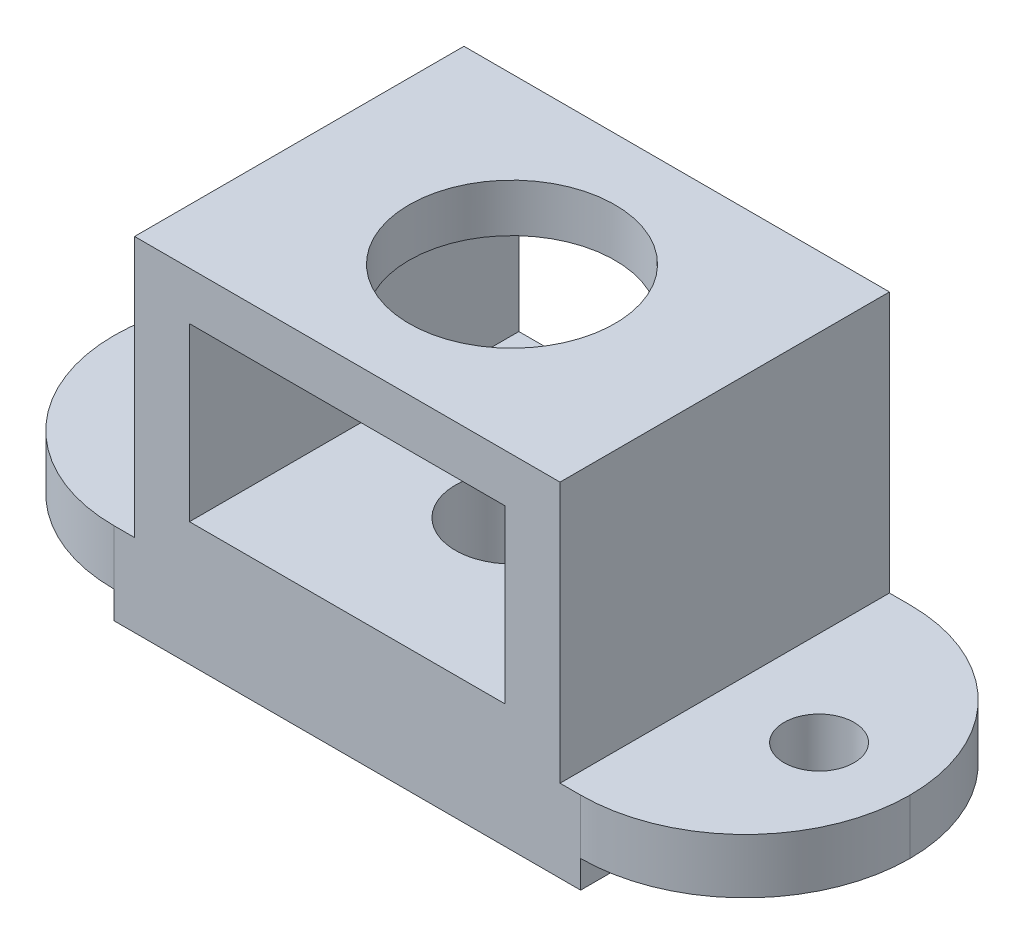
ISO-10303-21;
HEADER;
FILE_DESCRIPTION(('STEP AP214'),'2;1');
FILE_NAME('part.step','',(''),(''),'','','');
FILE_SCHEMA(('AUTOMOTIVE_DESIGN { 1 0 10303 214 1 1 1 1 }'));
ENDSEC;
DATA;
#1=APPLICATION_CONTEXT('core data for automotive mechanical design processes');
#2=APPLICATION_PROTOCOL_DEFINITION('international standard','automotive_design',2000,#1);
#3=PRODUCT_CONTEXT('',#1,'mechanical');
#4=PRODUCT('Part','Part','',(#3));
#5=PRODUCT_RELATED_PRODUCT_CATEGORY('part','',(#4));
#6=PRODUCT_DEFINITION_FORMATION('','',#4);
#7=PRODUCT_DEFINITION_CONTEXT('part definition',#1,'design');
#8=PRODUCT_DEFINITION('design','',#6,#7);
#9=PRODUCT_DEFINITION_SHAPE('','',#8);
#10=(LENGTH_UNIT() NAMED_UNIT(*) SI_UNIT(.MILLI.,.METRE.));
#11=(NAMED_UNIT(*) PLANE_ANGLE_UNIT() SI_UNIT($,.RADIAN.));
#12=(NAMED_UNIT(*) SI_UNIT($,.STERADIAN.) SOLID_ANGLE_UNIT());
#13=UNCERTAINTY_MEASURE_WITH_UNIT(LENGTH_MEASURE(1.E-05),#10,'distance_accuracy_value','');
#14=(GEOMETRIC_REPRESENTATION_CONTEXT(3) GLOBAL_UNCERTAINTY_ASSIGNED_CONTEXT((#13)) GLOBAL_UNIT_ASSIGNED_CONTEXT((#10,
#11,#12)) REPRESENTATION_CONTEXT('',''));
#15=CARTESIAN_POINT('',(0.,0.,0.));
#16=DIRECTION('',(0.,0.,1.));
#17=DIRECTION('',(1.,0.,0.));
#18=AXIS2_PLACEMENT_3D('',#15,#16,#17);
#19=CARTESIAN_POINT('',(92.0000000000001,0.,24.));
#20=DIRECTION('',(0.,-1.,0.));
#21=DIRECTION('',(0.,0.,-1.));
#22=AXIS2_PLACEMENT_3D('',#19,#20,#21);
#23=CYLINDRICAL_SURFACE('',#22,24.);
#24=DIRECTION('',(0.,1.,0.));
#25=VECTOR('',#24,1.);
#26=CARTESIAN_POINT('',(116.,0.,24.));
#27=LINE('',#26,#25);
#28=CARTESIAN_POINT('',(116.,0.,24.));
#29=VERTEX_POINT('',#28);
#30=CARTESIAN_POINT('',(116.,8.00000000000001,24.));
#31=VERTEX_POINT('',#30);
#32=EDGE_CURVE('E275',#29,#31,#27,.T.);
#33=ORIENTED_EDGE('',*,*,#32,.T.);
#34=CARTESIAN_POINT('',(92.0000000000001,8.,24.));
#35=DIRECTION('',(0.,-1.,0.));
#36=DIRECTION('',(1.,0.,0.));
#37=AXIS2_PLACEMENT_3D('',#34,#35,#36);
#38=CIRCLE('',#37,24.);
#39=CARTESIAN_POINT('',(92.0000000000001,8.,48.));
#40=VERTEX_POINT('',#39);
#41=EDGE_CURVE('E53',#40,#31,#38,.F.);
#42=ORIENTED_EDGE('',*,*,#41,.F.);
#43=DIRECTION('',(0.,-1.,0.));
#44=VECTOR('',#43,1.);
#45=CARTESIAN_POINT('',(92.0000000000001,0.,48.));
#46=LINE('',#45,#44);
#47=CARTESIAN_POINT('',(92.0000000000001,0.,48.));
#48=VERTEX_POINT('',#47);
#49=EDGE_CURVE('E286',#48,#40,#46,.F.);
#50=ORIENTED_EDGE('',*,*,#49,.F.);
#51=CARTESIAN_POINT('',(92.0000000000001,0.,24.));
#52=DIRECTION('',(0.,1.,0.));
#53=DIRECTION('',(0.,0.,1.));
#54=AXIS2_PLACEMENT_3D('',#51,#52,#53);
#55=CIRCLE('',#54,24.);
#56=EDGE_CURVE('E12',#29,#48,#55,.F.);
#57=ORIENTED_EDGE('',*,*,#56,.F.);
#58=EDGE_LOOP('',(#33,#42,#50,#57));
#59=FACE_BOUND('',#58,.T.);
#60=ADVANCED_FACE('F45',(#59),#23,.T.);
#61=CARTESIAN_POINT('',(92.0000000000001,0.,24.));
#62=DIRECTION('',(0.,-1.,0.));
#63=DIRECTION('',(0.,0.,-1.));
#64=AXIS2_PLACEMENT_3D('',#61,#62,#63);
#65=CYLINDRICAL_SURFACE('',#64,24.);
#66=ORIENTED_EDGE('',*,*,#32,.F.);
#67=CARTESIAN_POINT('',(92.0000000000001,0.,24.));
#68=DIRECTION('',(0.,1.,0.));
#69=DIRECTION('',(0.,0.,1.));
#70=AXIS2_PLACEMENT_3D('',#67,#68,#69);
#71=CIRCLE('',#70,24.);
#72=CARTESIAN_POINT('',(92.0000000000001,0.,0.));
#73=VERTEX_POINT('',#72);
#74=EDGE_CURVE('E281',#73,#29,#71,.F.);
#75=ORIENTED_EDGE('',*,*,#74,.F.);
#76=DIRECTION('',(0.,1.,0.));
#77=VECTOR('',#76,1.);
#78=CARTESIAN_POINT('',(92.0000000000001,0.,0.));
#79=LINE('',#78,#77);
#80=CARTESIAN_POINT('',(92.0000000000001,8.,0.));
#81=VERTEX_POINT('',#80);
#82=EDGE_CURVE('E278',#81,#73,#79,.F.);
#83=ORIENTED_EDGE('',*,*,#82,.F.);
#84=CARTESIAN_POINT('',(92.0000000000001,8.,24.));
#85=DIRECTION('',(0.,-1.,0.));
#86=DIRECTION('',(1.,0.,0.));
#87=AXIS2_PLACEMENT_3D('',#84,#85,#86);
#88=CIRCLE('',#87,24.);
#89=EDGE_CURVE('E284',#31,#81,#88,.F.);
#90=ORIENTED_EDGE('',*,*,#89,.F.);
#91=EDGE_LOOP('',(#66,#75,#83,#90));
#92=FACE_BOUND('',#91,.T.);
#93=ADVANCED_FACE('F351',(#92),#65,.T.);
#94=CARTESIAN_POINT('',(24.,0.,24.));
#95=DIRECTION('',(0.,1.,0.));
#96=DIRECTION('',(0.,0.,1.));
#97=AXIS2_PLACEMENT_3D('',#94,#95,#96);
#98=CYLINDRICAL_SURFACE('',#97,24.);
#99=DIRECTION('',(0.,1.,0.));
#100=VECTOR('',#99,1.);
#101=CARTESIAN_POINT('',(0.,0.,24.));
#102=LINE('',#101,#100);
#103=CARTESIAN_POINT('',(0.,0.,24.));
#104=VERTEX_POINT('',#103);
#105=CARTESIAN_POINT('',(0.,7.99999999999998,24.));
#106=VERTEX_POINT('',#105);
#107=EDGE_CURVE('E257',#104,#106,#102,.T.);
#108=ORIENTED_EDGE('',*,*,#107,.T.);
#109=CARTESIAN_POINT('',(24.,7.99999999999998,24.));
#110=DIRECTION('',(0.,-1.,0.));
#111=DIRECTION('',(0.,0.,-1.));
#112=AXIS2_PLACEMENT_3D('',#109,#110,#111);
#113=CIRCLE('',#112,24.);
#114=CARTESIAN_POINT('',(24.,7.99999999999998,0.));
#115=VERTEX_POINT('',#114);
#116=EDGE_CURVE('E271',#115,#106,#113,.F.);
#117=ORIENTED_EDGE('',*,*,#116,.F.);
#118=DIRECTION('',(0.,-1.,0.));
#119=VECTOR('',#118,1.);
#120=CARTESIAN_POINT('',(24.,0.,0.));
#121=LINE('',#120,#119);
#122=CARTESIAN_POINT('',(24.,0.,0.));
#123=VERTEX_POINT('',#122);
#124=EDGE_CURVE('E268',#123,#115,#121,.F.);
#125=ORIENTED_EDGE('',*,*,#124,.F.);
#126=CARTESIAN_POINT('',(24.,0.,24.));
#127=DIRECTION('',(0.,1.,0.));
#128=DIRECTION('',(0.,0.,1.));
#129=AXIS2_PLACEMENT_3D('',#126,#127,#128);
#130=CIRCLE('',#129,24.);
#131=EDGE_CURVE('E273',#104,#123,#130,.F.);
#132=ORIENTED_EDGE('',*,*,#131,.F.);
#133=EDGE_LOOP('',(#108,#117,#125,#132));
#134=FACE_BOUND('',#133,.T.);
#135=ADVANCED_FACE('F372',(#134),#98,.T.);
#136=CARTESIAN_POINT('',(24.,0.,24.));
#137=DIRECTION('',(0.,1.,0.));
#138=DIRECTION('',(0.,0.,1.));
#139=AXIS2_PLACEMENT_3D('',#136,#137,#138);
#140=CYLINDRICAL_SURFACE('',#139,24.);
#141=ORIENTED_EDGE('',*,*,#107,.F.);
#142=CARTESIAN_POINT('',(24.,0.,24.));
#143=DIRECTION('',(0.,1.,0.));
#144=DIRECTION('',(0.,0.,1.));
#145=AXIS2_PLACEMENT_3D('',#142,#143,#144);
#146=CIRCLE('',#145,24.);
#147=CARTESIAN_POINT('',(24.,0.,48.));
#148=VERTEX_POINT('',#147);
#149=EDGE_CURVE('E263',#148,#104,#146,.F.);
#150=ORIENTED_EDGE('',*,*,#149,.F.);
#151=DIRECTION('',(0.,1.,0.));
#152=VECTOR('',#151,1.);
#153=CARTESIAN_POINT('',(24.,0.,48.));
#154=LINE('',#153,#152);
#155=CARTESIAN_POINT('',(24.,7.99999999999998,48.));
#156=VERTEX_POINT('',#155);
#157=EDGE_CURVE('E260',#156,#148,#154,.F.);
#158=ORIENTED_EDGE('',*,*,#157,.F.);
#159=CARTESIAN_POINT('',(24.,7.99999999999998,24.));
#160=DIRECTION('',(0.,-1.,0.));
#161=DIRECTION('',(0.,0.,-1.));
#162=AXIS2_PLACEMENT_3D('',#159,#160,#161);
#163=CIRCLE('',#162,24.);
#164=EDGE_CURVE('E266',#106,#156,#163,.F.);
#165=ORIENTED_EDGE('',*,*,#164,.F.);
#166=EDGE_LOOP('',(#141,#150,#158,#165));
#167=FACE_BOUND('',#166,.T.);
#168=ADVANCED_FACE('F374',(#167),#140,.T.);
#169=CARTESIAN_POINT('',(0.,0.,48.));
#170=DIRECTION('',(0.,1.,0.));
#171=DIRECTION('',(0.,0.,1.));
#172=AXIS2_PLACEMENT_3D('',#169,#170,#171);
#173=PLANE('',#172);
#174=CARTESIAN_POINT('',(12.7433159182359,0.,24.));
#175=DIRECTION('',(0.,1.,0.));
#176=DIRECTION('',(0.,0.,1.));
#177=AXIS2_PLACEMENT_3D('',#174,#175,#176);
#178=CIRCLE('',#177,5.1);
#179=CARTESIAN_POINT('',(12.7433159182359,0.,29.1));
#180=VERTEX_POINT('',#179);
#181=EDGE_CURVE('E291',#180,#180,#178,.T.);
#182=ORIENTED_EDGE('',*,*,#181,.T.);
#183=EDGE_LOOP('',(#182));
#184=FACE_BOUND('',#183,.T.);
#185=ORIENTED_EDGE('',*,*,#149,.T.);
#186=ORIENTED_EDGE('',*,*,#131,.T.);
#187=DIRECTION('',(0.,0.,-1.));
#188=VECTOR('',#187,1.);
#189=CARTESIAN_POINT('',(24.,0.,48.));
#190=LINE('',#189,#188);
#191=EDGE_CURVE('E254',#148,#123,#190,.T.);
#192=ORIENTED_EDGE('',*,*,#191,.F.);
#193=EDGE_LOOP('',(#185,#186,#192));
#194=FACE_BOUND('',#193,.T.);
#195=ADVANCED_FACE('F369',(#184,#194),#173,.F.);
#196=CARTESIAN_POINT('',(24.,0.,48.));
#197=DIRECTION('',(1.,0.,0.));
#198=DIRECTION('',(0.,0.,-1.));
#199=AXIS2_PLACEMENT_3D('',#196,#197,#198);
#200=PLANE('',#199);
#201=DIRECTION('',(0.,-1.,0.));
#202=VECTOR('',#201,1.);
#203=CARTESIAN_POINT('',(24.,0.,0.));
#204=LINE('',#203,#202);
#205=CARTESIAN_POINT('',(24.,-3.99999999999999,0.));
#206=VERTEX_POINT('',#205);
#207=EDGE_CURVE('E194',#123,#206,#204,.T.);
#208=ORIENTED_EDGE('',*,*,#207,.T.);
#209=DIRECTION('',(0.,0.,-1.));
#210=VECTOR('',#209,1.);
#211=CARTESIAN_POINT('',(24.,-3.99999999999999,48.));
#212=LINE('',#211,#210);
#213=CARTESIAN_POINT('',(24.,-3.99999999999999,48.));
#214=VERTEX_POINT('',#213);
#215=EDGE_CURVE('E251',#214,#206,#212,.T.);
#216=ORIENTED_EDGE('',*,*,#215,.F.);
#217=DIRECTION('',(0.,-1.,0.));
#218=VECTOR('',#217,1.);
#219=CARTESIAN_POINT('',(24.,0.,48.));
#220=LINE('',#219,#218);
#221=EDGE_CURVE('E198',#148,#214,#220,.T.);
#222=ORIENTED_EDGE('',*,*,#221,.F.);
#223=ORIENTED_EDGE('',*,*,#191,.T.);
#224=EDGE_LOOP('',(#208,#216,#222,#223));
#225=FACE_BOUND('',#224,.T.);
#226=ADVANCED_FACE('F367',(#225),#200,.F.);
#227=CARTESIAN_POINT('',(24.,-3.99999999999999,48.));
#228=DIRECTION('',(0.,1.,0.));
#229=DIRECTION('',(0.,0.,1.));
#230=AXIS2_PLACEMENT_3D('',#227,#228,#229);
#231=PLANE('',#230);
#232=CARTESIAN_POINT('',(58.,-3.99999999999999,24.));
#233=DIRECTION('',(0.,-1.,0.));
#234=DIRECTION('',(0.,0.,-1.));
#235=AXIS2_PLACEMENT_3D('',#232,#233,#234);
#236=CIRCLE('',#235,8.25);
#237=CARTESIAN_POINT('',(58.,-3.99999999999999,15.75));
#238=VERTEX_POINT('',#237);
#239=EDGE_CURVE('E297',#238,#238,#236,.T.);
#240=ORIENTED_EDGE('',*,*,#239,.F.);
#241=EDGE_LOOP('',(#240));
#242=FACE_BOUND('',#241,.T.);
#243=DIRECTION('',(1.,0.,0.));
#244=VECTOR('',#243,1.);
#245=CARTESIAN_POINT('',(24.,-3.99999999999999,0.));
#246=LINE('',#245,#244);
#247=CARTESIAN_POINT('',(92.0000000000001,-3.99999999999999,0.));
#248=VERTEX_POINT('',#247);
#249=EDGE_CURVE('E219',#206,#248,#246,.T.);
#250=ORIENTED_EDGE('',*,*,#249,.T.);
#251=DIRECTION('',(0.,0.,-1.));
#252=VECTOR('',#251,1.);
#253=CARTESIAN_POINT('',(92.0000000000001,-3.99999999999999,48.));
#254=LINE('',#253,#252);
#255=CARTESIAN_POINT('',(92.0000000000001,-3.99999999999999,48.));
#256=VERTEX_POINT('',#255);
#257=EDGE_CURVE('E248',#256,#248,#254,.T.);
#258=ORIENTED_EDGE('',*,*,#257,.F.);
#259=DIRECTION('',(1.,0.,0.));
#260=VECTOR('',#259,1.);
#261=CARTESIAN_POINT('',(24.,-3.99999999999999,48.));
#262=LINE('',#261,#260);
#263=EDGE_CURVE('E200',#214,#256,#262,.T.);
#264=ORIENTED_EDGE('',*,*,#263,.F.);
#265=ORIENTED_EDGE('',*,*,#215,.T.);
#266=EDGE_LOOP('',(#250,#258,#264,#265));
#267=FACE_BOUND('',#266,.T.);
#268=ADVANCED_FACE('F362',(#242,#267),#231,.F.);
#269=CARTESIAN_POINT('',(92.0000000000001,-3.99999999999999,48.));
#270=DIRECTION('',(-1.,0.,0.));
#271=DIRECTION('',(0.,0.,1.));
#272=AXIS2_PLACEMENT_3D('',#269,#270,#271);
#273=PLANE('',#272);
#274=DIRECTION('',(0.,1.,0.));
#275=VECTOR('',#274,1.);
#276=CARTESIAN_POINT('',(92.0000000000001,-3.99999999999999,0.));
#277=LINE('',#276,#275);
#278=EDGE_CURVE('E221',#248,#73,#277,.T.);
#279=ORIENTED_EDGE('',*,*,#278,.T.);
#280=DIRECTION('',(0.,0.,-1.));
#281=VECTOR('',#280,1.);
#282=CARTESIAN_POINT('',(92.0000000000001,0.,48.));
#283=LINE('',#282,#281);
#284=EDGE_CURVE('E245',#48,#73,#283,.T.);
#285=ORIENTED_EDGE('',*,*,#284,.F.);
#286=DIRECTION('',(0.,1.,0.));
#287=VECTOR('',#286,1.);
#288=CARTESIAN_POINT('',(92.0000000000001,-3.99999999999999,48.));
#289=LINE('',#288,#287);
#290=EDGE_CURVE('E203',#256,#48,#289,.T.);
#291=ORIENTED_EDGE('',*,*,#290,.F.);
#292=ORIENTED_EDGE('',*,*,#257,.T.);
#293=EDGE_LOOP('',(#279,#285,#291,#292));
#294=FACE_BOUND('',#293,.T.);
#295=ADVANCED_FACE('F358',(#294),#273,.F.);
#296=CARTESIAN_POINT('',(92.0000000000001,0.,48.));
#297=DIRECTION('',(0.,1.,0.));
#298=DIRECTION('',(0.,0.,1.));
#299=AXIS2_PLACEMENT_3D('',#296,#297,#298);
#300=PLANE('',#299);
#301=CARTESIAN_POINT('',(102.743315918236,0.,24.));
#302=DIRECTION('',(0.,1.,0.));
#303=DIRECTION('',(0.,0.,1.));
#304=AXIS2_PLACEMENT_3D('',#301,#302,#303);
#305=CIRCLE('',#304,5.1);
#306=CARTESIAN_POINT('',(102.743315918236,0.,29.1));
#307=VERTEX_POINT('',#306);
#308=EDGE_CURVE('E181',#307,#307,#305,.T.);
#309=ORIENTED_EDGE('',*,*,#308,.T.);
#310=EDGE_LOOP('',(#309));
#311=FACE_BOUND('',#310,.T.);
#312=ORIENTED_EDGE('',*,*,#74,.T.);
#313=ORIENTED_EDGE('',*,*,#56,.T.);
#314=ORIENTED_EDGE('',*,*,#284,.T.);
#315=EDGE_LOOP('',(#312,#313,#314));
#316=FACE_BOUND('',#315,.T.);
#317=ADVANCED_FACE('F353',(#311,#316),#300,.F.);
#318=CARTESIAN_POINT('',(116.,8.00000000000001,48.));
#319=DIRECTION('',(0.,-1.,0.));
#320=DIRECTION('',(1.,0.,0.));
#321=AXIS2_PLACEMENT_3D('',#318,#319,#320);
#322=PLANE('',#321);
#323=CARTESIAN_POINT('',(102.743315918236,8.00000000000001,24.));
#324=DIRECTION('',(0.,-1.,0.));
#325=DIRECTION('',(1.,0.,0.));
#326=AXIS2_PLACEMENT_3D('',#323,#324,#325);
#327=CIRCLE('',#326,5.1);
#328=CARTESIAN_POINT('',(107.843315918236,8.00000000000001,24.));
#329=VERTEX_POINT('',#328);
#330=EDGE_CURVE('E48',#329,#329,#327,.T.);
#331=ORIENTED_EDGE('',*,*,#330,.T.);
#332=EDGE_LOOP('',(#331));
#333=FACE_BOUND('',#332,.T.);
#334=DIRECTION('',(-1.,0.,0.));
#335=VECTOR('',#334,1.);
#336=CARTESIAN_POINT('',(116.,8.00000000000001,48.));
#337=LINE('',#336,#335);
#338=CARTESIAN_POINT('',(89.0000000000001,8.,48.));
#339=VERTEX_POINT('',#338);
#340=EDGE_CURVE('E206',#40,#339,#337,.T.);
#341=ORIENTED_EDGE('',*,*,#340,.F.);
#342=ORIENTED_EDGE('',*,*,#41,.T.);
#343=ORIENTED_EDGE('',*,*,#89,.T.);
#344=DIRECTION('',(-1.,0.,0.));
#345=VECTOR('',#344,1.);
#346=CARTESIAN_POINT('',(116.,8.00000000000001,0.));
#347=LINE('',#346,#345);
#348=CARTESIAN_POINT('',(89.0000000000001,8.,0.));
#349=VERTEX_POINT('',#348);
#350=EDGE_CURVE('E224',#81,#349,#347,.T.);
#351=ORIENTED_EDGE('',*,*,#350,.T.);
#352=DIRECTION('',(0.,0.,-1.));
#353=VECTOR('',#352,1.);
#354=CARTESIAN_POINT('',(89.0000000000001,8.,48.));
#355=LINE('',#354,#353);
#356=EDGE_CURVE('E242',#339,#349,#355,.T.);
#357=ORIENTED_EDGE('',*,*,#356,.F.);
#358=EDGE_LOOP('',(#341,#342,#343,#351,#357));
#359=FACE_BOUND('',#358,.T.);
#360=ADVANCED_FACE('F347',(#333,#359),#322,.F.);
#361=CARTESIAN_POINT('',(89.0000000000001,8.,48.));
#362=DIRECTION('',(-1.,0.,0.));
#363=DIRECTION('',(0.,0.,1.));
#364=AXIS2_PLACEMENT_3D('',#361,#362,#363);
#365=PLANE('',#364);
#366=DIRECTION('',(0.,1.,0.));
#367=VECTOR('',#366,1.);
#368=CARTESIAN_POINT('',(89.0000000000001,8.,0.));
#369=LINE('',#368,#367);
#370=CARTESIAN_POINT('',(89.0000000000001,46.,0.));
#371=VERTEX_POINT('',#370);
#372=EDGE_CURVE('E226',#349,#371,#369,.T.);
#373=ORIENTED_EDGE('',*,*,#372,.T.);
#374=DIRECTION('',(0.,0.,-1.));
#375=VECTOR('',#374,1.);
#376=CARTESIAN_POINT('',(89.0000000000001,46.,48.));
#377=LINE('',#376,#375);
#378=CARTESIAN_POINT('',(89.0000000000001,46.,48.));
#379=VERTEX_POINT('',#378);
#380=EDGE_CURVE('E239',#379,#371,#377,.T.);
#381=ORIENTED_EDGE('',*,*,#380,.F.);
#382=DIRECTION('',(0.,1.,0.));
#383=VECTOR('',#382,1.);
#384=CARTESIAN_POINT('',(89.0000000000001,8.,48.));
#385=LINE('',#384,#383);
#386=EDGE_CURVE('E208',#339,#379,#385,.T.);
#387=ORIENTED_EDGE('',*,*,#386,.F.);
#388=ORIENTED_EDGE('',*,*,#356,.T.);
#389=EDGE_LOOP('',(#373,#381,#387,#388));
#390=FACE_BOUND('',#389,.T.);
#391=ADVANCED_FACE('F317',(#390),#365,.F.);
#392=CARTESIAN_POINT('',(89.0000000000001,46.,48.));
#393=DIRECTION('',(0.,-1.,0.));
#394=DIRECTION('',(1.,0.,0.));
#395=AXIS2_PLACEMENT_3D('',#392,#393,#394);
#396=PLANE('',#395);
#397=CARTESIAN_POINT('',(58.0000000000001,46.,24.));
#398=DIRECTION('',(0.,1.,0.));
#399=DIRECTION('',(-1.,0.,0.));
#400=AXIS2_PLACEMENT_3D('',#397,#398,#399);
#401=CIRCLE('',#400,15.);
#402=CARTESIAN_POINT('',(43.0000000000001,46.,24.));
#403=VERTEX_POINT('',#402);
#404=EDGE_CURVE('E307',#403,#403,#401,.T.);
#405=ORIENTED_EDGE('',*,*,#404,.F.);
#406=EDGE_LOOP('',(#405));
#407=FACE_BOUND('',#406,.T.);
#408=DIRECTION('',(-1.,0.,0.));
#409=VECTOR('',#408,1.);
#410=CARTESIAN_POINT('',(89.0000000000001,46.,0.));
#411=LINE('',#410,#409);
#412=CARTESIAN_POINT('',(27.0000000000001,46.,0.));
#413=VERTEX_POINT('',#412);
#414=EDGE_CURVE('E228',#371,#413,#411,.T.);
#415=ORIENTED_EDGE('',*,*,#414,.T.);
#416=DIRECTION('',(0.,0.,-1.));
#417=VECTOR('',#416,1.);
#418=CARTESIAN_POINT('',(27.0000000000001,46.,48.));
#419=LINE('',#418,#417);
#420=CARTESIAN_POINT('',(27.0000000000001,46.,48.));
#421=VERTEX_POINT('',#420);
#422=EDGE_CURVE('E236',#421,#413,#419,.T.);
#423=ORIENTED_EDGE('',*,*,#422,.F.);
#424=DIRECTION('',(-1.,0.,0.));
#425=VECTOR('',#424,1.);
#426=CARTESIAN_POINT('',(89.0000000000001,46.,48.));
#427=LINE('',#426,#425);
#428=EDGE_CURVE('E210',#379,#421,#427,.T.);
#429=ORIENTED_EDGE('',*,*,#428,.F.);
#430=ORIENTED_EDGE('',*,*,#380,.T.);
#431=EDGE_LOOP('',(#415,#423,#429,#430));
#432=FACE_BOUND('',#431,.T.);
#433=ADVANCED_FACE('F313',(#407,#432),#396,.F.);
#434=CARTESIAN_POINT('',(27.0000000000001,46.,48.));
#435=DIRECTION('',(1.,0.,0.));
#436=DIRECTION('',(0.,1.,0.));
#437=AXIS2_PLACEMENT_3D('',#434,#435,#436);
#438=PLANE('',#437);
#439=DIRECTION('',(0.,-1.,0.));
#440=VECTOR('',#439,1.);
#441=CARTESIAN_POINT('',(27.0000000000001,46.,0.));
#442=LINE('',#441,#440);
#443=CARTESIAN_POINT('',(27.0000000000001,7.99999999999998,0.));
#444=VERTEX_POINT('',#443);
#445=EDGE_CURVE('E230',#413,#444,#442,.T.);
#446=ORIENTED_EDGE('',*,*,#445,.T.);
#447=DIRECTION('',(0.,0.,-1.));
#448=VECTOR('',#447,1.);
#449=CARTESIAN_POINT('',(27.0000000000001,7.99999999999998,48.));
#450=LINE('',#449,#448);
#451=CARTESIAN_POINT('',(27.0000000000001,7.99999999999998,48.));
#452=VERTEX_POINT('',#451);
#453=EDGE_CURVE('E217',#452,#444,#450,.T.);
#454=ORIENTED_EDGE('',*,*,#453,.F.);
#455=DIRECTION('',(0.,-1.,0.));
#456=VECTOR('',#455,1.);
#457=CARTESIAN_POINT('',(27.0000000000001,46.,48.));
#458=LINE('',#457,#456);
#459=EDGE_CURVE('E212',#421,#452,#458,.T.);
#460=ORIENTED_EDGE('',*,*,#459,.F.);
#461=ORIENTED_EDGE('',*,*,#422,.T.);
#462=EDGE_LOOP('',(#446,#454,#460,#461));
#463=FACE_BOUND('',#462,.T.);
#464=ADVANCED_FACE('F316',(#463),#438,.F.);
#465=CARTESIAN_POINT('',(0.,7.99999999999998,48.));
#466=DIRECTION('',(0.,-1.,0.));
#467=DIRECTION('',(0.,0.,-1.));
#468=AXIS2_PLACEMENT_3D('',#465,#466,#467);
#469=PLANE('',#468);
#470=CARTESIAN_POINT('',(12.7433159182359,7.99999999999998,24.));
#471=DIRECTION('',(0.,-1.,0.));
#472=DIRECTION('',(0.,0.,-1.));
#473=AXIS2_PLACEMENT_3D('',#470,#471,#472);
#474=CIRCLE('',#473,5.1);
#475=CARTESIAN_POINT('',(12.7433159182359,7.99999999999998,18.9));
#476=VERTEX_POINT('',#475);
#477=EDGE_CURVE('E289',#476,#476,#474,.T.);
#478=ORIENTED_EDGE('',*,*,#477,.T.);
#479=EDGE_LOOP('',(#478));
#480=FACE_BOUND('',#479,.T.);
#481=DIRECTION('',(-1.,0.,0.));
#482=VECTOR('',#481,1.);
#483=CARTESIAN_POINT('',(0.,7.99999999999998,0.));
#484=LINE('',#483,#482);
#485=EDGE_CURVE('E201',#444,#115,#484,.T.);
#486=ORIENTED_EDGE('',*,*,#485,.T.);
#487=ORIENTED_EDGE('',*,*,#116,.T.);
#488=ORIENTED_EDGE('',*,*,#164,.T.);
#489=DIRECTION('',(-1.,0.,0.));
#490=VECTOR('',#489,1.);
#491=CARTESIAN_POINT('',(0.,7.99999999999998,48.));
#492=LINE('',#491,#490);
#493=EDGE_CURVE('E214',#452,#156,#492,.T.);
#494=ORIENTED_EDGE('',*,*,#493,.F.);
#495=ORIENTED_EDGE('',*,*,#453,.T.);
#496=EDGE_LOOP('',(#486,#487,#488,#494,#495));
#497=FACE_BOUND('',#496,.T.);
#498=ADVANCED_FACE('F333',(#480,#497),#469,.F.);
#499=CARTESIAN_POINT('',(0.,0.,48.));
#500=DIRECTION('',(0.,0.,-1.));
#501=DIRECTION('',(-1.,0.,0.));
#502=AXIS2_PLACEMENT_3D('',#499,#500,#501);
#503=PLANE('',#502);
#504=DIRECTION('',(1.,0.,0.));
#505=VECTOR('',#504,1.);
#506=CARTESIAN_POINT('',(35.0000000000001,14.,48.));
#507=LINE('',#506,#505);
#508=CARTESIAN_POINT('',(35.0000000000001,14.,48.));
#509=VERTEX_POINT('',#508);
#510=CARTESIAN_POINT('',(81.0000000000001,14.,48.));
#511=VERTEX_POINT('',#510);
#512=EDGE_CURVE('E188',#509,#511,#507,.T.);
#513=ORIENTED_EDGE('',*,*,#512,.F.);
#514=DIRECTION('',(0.,-1.,0.));
#515=VECTOR('',#514,1.);
#516=CARTESIAN_POINT('',(35.0000000000001,14.,48.));
#517=LINE('',#516,#515);
#518=CARTESIAN_POINT('',(35.0000000000001,39.,48.));
#519=VERTEX_POINT('',#518);
#520=EDGE_CURVE('E61',#519,#509,#517,.T.);
#521=ORIENTED_EDGE('',*,*,#520,.F.);
#522=DIRECTION('',(-1.,0.,0.));
#523=VECTOR('',#522,1.);
#524=CARTESIAN_POINT('',(35.0000000000001,39.,48.));
#525=LINE('',#524,#523);
#526=CARTESIAN_POINT('',(81.0000000000001,39.,48.));
#527=VERTEX_POINT('',#526);
#528=EDGE_CURVE('E176',#527,#519,#525,.T.);
#529=ORIENTED_EDGE('',*,*,#528,.F.);
#530=DIRECTION('',(0.,1.,0.));
#531=VECTOR('',#530,1.);
#532=CARTESIAN_POINT('',(81.0000000000001,14.,48.));
#533=LINE('',#532,#531);
#534=EDGE_CURVE('E179',#511,#527,#533,.T.);
#535=ORIENTED_EDGE('',*,*,#534,.F.);
#536=EDGE_LOOP('',(#513,#521,#529,#535));
#537=FACE_BOUND('',#536,.T.);
#538=ORIENTED_EDGE('',*,*,#290,.T.);
#539=ORIENTED_EDGE('',*,*,#49,.T.);
#540=ORIENTED_EDGE('',*,*,#340,.T.);
#541=ORIENTED_EDGE('',*,*,#386,.T.);
#542=ORIENTED_EDGE('',*,*,#428,.T.);
#543=ORIENTED_EDGE('',*,*,#459,.T.);
#544=ORIENTED_EDGE('',*,*,#493,.T.);
#545=ORIENTED_EDGE('',*,*,#157,.T.);
#546=ORIENTED_EDGE('',*,*,#221,.T.);
#547=ORIENTED_EDGE('',*,*,#263,.T.);
#548=EDGE_LOOP('',(#538,#539,#540,#541,#542,#543,#544,#545,#546,#547));
#549=FACE_BOUND('',#548,.T.);
#550=ADVANCED_FACE('F338',(#537,#549),#503,.F.);
#551=CARTESIAN_POINT('',(0.,0.,0.));
#552=DIRECTION('',(0.,0.,-1.));
#553=DIRECTION('',(-1.,0.,0.));
#554=AXIS2_PLACEMENT_3D('',#551,#552,#553);
#555=PLANE('',#554);
#556=DIRECTION('',(0.,-1.,0.));
#557=VECTOR('',#556,1.);
#558=CARTESIAN_POINT('',(35.0000000000001,14.,0.));
#559=LINE('',#558,#557);
#560=CARTESIAN_POINT('',(35.0000000000001,39.,0.));
#561=VERTEX_POINT('',#560);
#562=CARTESIAN_POINT('',(35.0000000000001,14.,0.));
#563=VERTEX_POINT('',#562);
#564=EDGE_CURVE('E160',#561,#563,#559,.T.);
#565=ORIENTED_EDGE('',*,*,#564,.T.);
#566=DIRECTION('',(1.,0.,0.));
#567=VECTOR('',#566,1.);
#568=CARTESIAN_POINT('',(35.0000000000001,14.,0.));
#569=LINE('',#568,#567);
#570=CARTESIAN_POINT('',(81.0000000000001,14.,0.));
#571=VERTEX_POINT('',#570);
#572=EDGE_CURVE('E169',#563,#571,#569,.T.);
#573=ORIENTED_EDGE('',*,*,#572,.T.);
#574=DIRECTION('',(0.,1.,0.));
#575=VECTOR('',#574,1.);
#576=CARTESIAN_POINT('',(81.0000000000001,14.,0.));
#577=LINE('',#576,#575);
#578=CARTESIAN_POINT('',(81.0000000000001,39.,0.));
#579=VERTEX_POINT('',#578);
#580=EDGE_CURVE('E69',#571,#579,#577,.T.);
#581=ORIENTED_EDGE('',*,*,#580,.T.);
#582=DIRECTION('',(-1.,0.,0.));
#583=VECTOR('',#582,1.);
#584=CARTESIAN_POINT('',(35.0000000000001,39.,0.));
#585=LINE('',#584,#583);
#586=EDGE_CURVE('E166',#579,#561,#585,.T.);
#587=ORIENTED_EDGE('',*,*,#586,.T.);
#588=EDGE_LOOP('',(#565,#573,#581,#587));
#589=FACE_BOUND('',#588,.T.);
#590=ORIENTED_EDGE('',*,*,#350,.F.);
#591=ORIENTED_EDGE('',*,*,#82,.T.);
#592=ORIENTED_EDGE('',*,*,#278,.F.);
#593=ORIENTED_EDGE('',*,*,#249,.F.);
#594=ORIENTED_EDGE('',*,*,#207,.F.);
#595=ORIENTED_EDGE('',*,*,#124,.T.);
#596=ORIENTED_EDGE('',*,*,#485,.F.);
#597=ORIENTED_EDGE('',*,*,#445,.F.);
#598=ORIENTED_EDGE('',*,*,#414,.F.);
#599=ORIENTED_EDGE('',*,*,#372,.F.);
#600=EDGE_LOOP('',(#590,#591,#592,#593,#594,#595,#596,#597,#598,#599));
#601=FACE_BOUND('',#600,.T.);
#602=ADVANCED_FACE('F173',(#589,#601),#555,.T.);
#603=CARTESIAN_POINT('',(35.0000000000001,14.,0.));
#604=DIRECTION('',(-1.,0.,0.));
#605=DIRECTION('',(0.,0.,1.));
#606=AXIS2_PLACEMENT_3D('',#603,#604,#605);
#607=PLANE('',#606);
#608=ORIENTED_EDGE('',*,*,#520,.T.);
#609=DIRECTION('',(0.,0.,1.));
#610=VECTOR('',#609,1.);
#611=CARTESIAN_POINT('',(35.0000000000001,14.,0.));
#612=LINE('',#611,#610);
#613=EDGE_CURVE('E156',#563,#509,#612,.T.);
#614=ORIENTED_EDGE('',*,*,#613,.F.);
#615=ORIENTED_EDGE('',*,*,#564,.F.);
#616=DIRECTION('',(0.,0.,1.));
#617=VECTOR('',#616,1.);
#618=CARTESIAN_POINT('',(35.0000000000001,39.,0.));
#619=LINE('',#618,#617);
#620=EDGE_CURVE('E192',#561,#519,#619,.T.);
#621=ORIENTED_EDGE('',*,*,#620,.T.);
#622=EDGE_LOOP('',(#608,#614,#615,#621));
#623=FACE_BOUND('',#622,.T.);
#624=ADVANCED_FACE('F158',(#623),#607,.F.);
#625=CARTESIAN_POINT('',(35.0000000000001,39.,0.));
#626=DIRECTION('',(0.,1.,0.));
#627=DIRECTION('',(0.,0.,1.));
#628=AXIS2_PLACEMENT_3D('',#625,#626,#627);
#629=PLANE('',#628);
#630=CARTESIAN_POINT('',(58.0000000000001,39.,24.));
#631=DIRECTION('',(0.,1.,0.));
#632=DIRECTION('',(0.,0.,1.));
#633=AXIS2_PLACEMENT_3D('',#630,#631,#632);
#634=CIRCLE('',#633,15.);
#635=CARTESIAN_POINT('',(58.0000000000001,39.,39.));
#636=VERTEX_POINT('',#635);
#637=EDGE_CURVE('E302',#636,#636,#634,.F.);
#638=ORIENTED_EDGE('',*,*,#637,.F.);
#639=EDGE_LOOP('',(#638));
#640=FACE_BOUND('',#639,.T.);
#641=ORIENTED_EDGE('',*,*,#528,.T.);
#642=ORIENTED_EDGE('',*,*,#620,.F.);
#643=ORIENTED_EDGE('',*,*,#586,.F.);
#644=DIRECTION('',(0.,0.,1.));
#645=VECTOR('',#644,1.);
#646=CARTESIAN_POINT('',(81.0000000000001,39.,0.));
#647=LINE('',#646,#645);
#648=EDGE_CURVE('E195',#579,#527,#647,.T.);
#649=ORIENTED_EDGE('',*,*,#648,.T.);
#650=EDGE_LOOP('',(#641,#642,#643,#649));
#651=FACE_BOUND('',#650,.T.);
#652=ADVANCED_FACE('F492',(#640,#651),#629,.F.);
#653=CARTESIAN_POINT('',(81.0000000000001,14.,0.));
#654=DIRECTION('',(1.,0.,0.));
#655=DIRECTION('',(0.,0.,-1.));
#656=AXIS2_PLACEMENT_3D('',#653,#654,#655);
#657=PLANE('',#656);
#658=ORIENTED_EDGE('',*,*,#534,.T.);
#659=ORIENTED_EDGE('',*,*,#648,.F.);
#660=ORIENTED_EDGE('',*,*,#580,.F.);
#661=DIRECTION('',(0.,0.,1.));
#662=VECTOR('',#661,1.);
#663=CARTESIAN_POINT('',(81.0000000000001,14.,0.));
#664=LINE('',#663,#662);
#665=EDGE_CURVE('E165',#571,#511,#664,.T.);
#666=ORIENTED_EDGE('',*,*,#665,.T.);
#667=EDGE_LOOP('',(#658,#659,#660,#666));
#668=FACE_BOUND('',#667,.T.);
#669=ADVANCED_FACE('F467',(#668),#657,.F.);
#670=CARTESIAN_POINT('',(35.0000000000001,14.,0.));
#671=DIRECTION('',(0.,-1.,0.));
#672=DIRECTION('',(0.,0.,-1.));
#673=AXIS2_PLACEMENT_3D('',#670,#671,#672);
#674=PLANE('',#673);
#675=CARTESIAN_POINT('',(58.,14.,24.));
#676=DIRECTION('',(0.,-1.,0.));
#677=DIRECTION('',(0.,0.,-1.));
#678=AXIS2_PLACEMENT_3D('',#675,#676,#677);
#679=CIRCLE('',#678,8.25);
#680=CARTESIAN_POINT('',(58.,14.,15.75));
#681=VERTEX_POINT('',#680);
#682=EDGE_CURVE('E292',#681,#681,#679,.F.);
#683=ORIENTED_EDGE('',*,*,#682,.F.);
#684=EDGE_LOOP('',(#683));
#685=FACE_BOUND('',#684,.T.);
#686=ORIENTED_EDGE('',*,*,#512,.T.);
#687=ORIENTED_EDGE('',*,*,#665,.F.);
#688=ORIENTED_EDGE('',*,*,#572,.F.);
#689=ORIENTED_EDGE('',*,*,#613,.T.);
#690=EDGE_LOOP('',(#686,#687,#688,#689));
#691=FACE_BOUND('',#690,.T.);
#692=ADVANCED_FACE('F170',(#685,#691),#674,.F.);
#693=CARTESIAN_POINT('',(12.7433159182359,44.,24.));
#694=DIRECTION('',(0.,-1.,0.));
#695=DIRECTION('',(0.,0.,-1.));
#696=AXIS2_PLACEMENT_3D('',#693,#694,#695);
#697=CYLINDRICAL_SURFACE('',#696,5.1);
#698=ORIENTED_EDGE('',*,*,#477,.F.);
#699=EDGE_LOOP('',(#698));
#700=FACE_BOUND('',#699,.T.);
#701=ORIENTED_EDGE('',*,*,#181,.F.);
#702=EDGE_LOOP('',(#701));
#703=FACE_BOUND('',#702,.T.);
#704=ADVANCED_FACE('F466',(#700,#703),#697,.F.);
#705=CARTESIAN_POINT('',(102.743315918236,44.,24.));
#706=DIRECTION('',(0.,-1.,0.));
#707=DIRECTION('',(0.,0.,-1.));
#708=AXIS2_PLACEMENT_3D('',#705,#706,#707);
#709=CYLINDRICAL_SURFACE('',#708,5.1);
#710=ORIENTED_EDGE('',*,*,#330,.F.);
#711=EDGE_LOOP('',(#710));
#712=FACE_BOUND('',#711,.T.);
#713=ORIENTED_EDGE('',*,*,#308,.F.);
#714=EDGE_LOOP('',(#713));
#715=FACE_BOUND('',#714,.T.);
#716=ADVANCED_FACE('F457',(#712,#715),#709,.F.);
#717=CARTESIAN_POINT('',(58.,37.3345237791561,24.));
#718=DIRECTION('',(0.,-1.,0.));
#719=DIRECTION('',(0.,0.,-1.));
#720=AXIS2_PLACEMENT_3D('',#717,#718,#719);
#721=CYLINDRICAL_SURFACE('',#720,8.25);
#722=ORIENTED_EDGE('',*,*,#682,.T.);
#723=EDGE_LOOP('',(#722));
#724=FACE_BOUND('',#723,.T.);
#725=ORIENTED_EDGE('',*,*,#239,.T.);
#726=EDGE_LOOP('',(#725));
#727=FACE_BOUND('',#726,.T.);
#728=ADVANCED_FACE('F477',(#724,#727),#721,.F.);
#729=CARTESIAN_POINT('',(58.0000000000001,-3.42640687119283,24.));
#730=DIRECTION('',(0.,1.,0.));
#731=DIRECTION('',(-1.,0.,0.));
#732=AXIS2_PLACEMENT_3D('',#729,#730,#731);
#733=CYLINDRICAL_SURFACE('',#732,15.);
#734=ORIENTED_EDGE('',*,*,#637,.T.);
#735=EDGE_LOOP('',(#734));
#736=FACE_BOUND('',#735,.T.);
#737=ORIENTED_EDGE('',*,*,#404,.T.);
#738=EDGE_LOOP('',(#737));
#739=FACE_BOUND('',#738,.T.);
#740=ADVANCED_FACE('F311',(#736,#739),#733,.F.);
#741=CLOSED_SHELL('',(#60,#93,#135,#168,#195,#226,#268,#295,#317,#360,#391,#433,#464,#498,#550,
#602,#624,#652,#669,#692,#704,#716,#728,#740));
#742=MANIFOLD_SOLID_BREP('B2',#741);
#743=ADVANCED_BREP_SHAPE_REPRESENTATION('',(#18,#742),#14);
#744=SHAPE_DEFINITION_REPRESENTATION(#9,#743);
ENDSEC;
END-ISO-10303-21;
